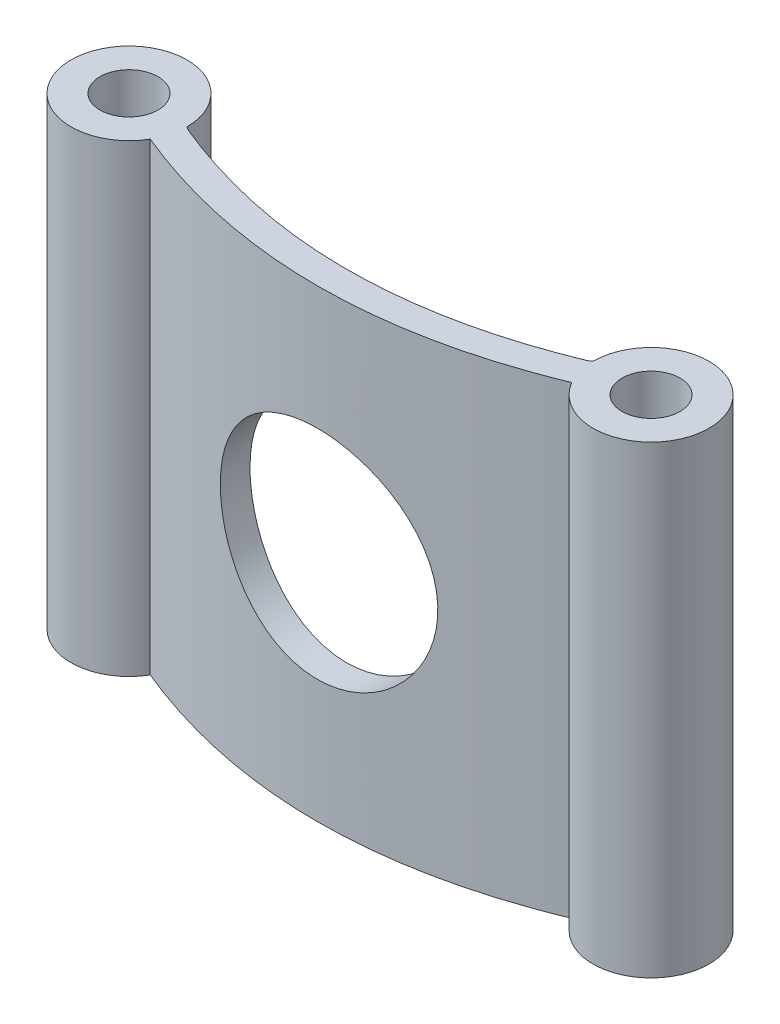
ISO-10303-21;
HEADER;
FILE_DESCRIPTION(('STEP AP214'),'2;1');
FILE_NAME('part.step','',(''),(''),'','','');
FILE_SCHEMA(('AUTOMOTIVE_DESIGN { 1 0 10303 214 1 1 1 1 }'));
ENDSEC;
DATA;
#1=APPLICATION_CONTEXT('core data for automotive mechanical design processes');
#2=APPLICATION_PROTOCOL_DEFINITION('international standard','automotive_design',2000,#1);
#3=PRODUCT_CONTEXT('',#1,'mechanical');
#4=PRODUCT('Part','Part','',(#3));
#5=PRODUCT_RELATED_PRODUCT_CATEGORY('part','',(#4));
#6=PRODUCT_DEFINITION_FORMATION('','',#4);
#7=PRODUCT_DEFINITION_CONTEXT('part definition',#1,'design');
#8=PRODUCT_DEFINITION('design','',#6,#7);
#9=PRODUCT_DEFINITION_SHAPE('','',#8);
#10=(LENGTH_UNIT() NAMED_UNIT(*) SI_UNIT(.MILLI.,.METRE.));
#11=(NAMED_UNIT(*) PLANE_ANGLE_UNIT() SI_UNIT($,.RADIAN.));
#12=(NAMED_UNIT(*) SI_UNIT($,.STERADIAN.) SOLID_ANGLE_UNIT());
#13=UNCERTAINTY_MEASURE_WITH_UNIT(LENGTH_MEASURE(1.E-05),#10,'distance_accuracy_value','');
#14=(GEOMETRIC_REPRESENTATION_CONTEXT(3) GLOBAL_UNCERTAINTY_ASSIGNED_CONTEXT((#13)) GLOBAL_UNIT_ASSIGNED_CONTEXT((#10,
#11,#12)) REPRESENTATION_CONTEXT('',''));
#15=CARTESIAN_POINT('',(0.,0.,0.));
#16=DIRECTION('',(0.,0.,1.));
#17=DIRECTION('',(1.,0.,0.));
#18=AXIS2_PLACEMENT_3D('',#15,#16,#17);
#19=CARTESIAN_POINT('',(-14.5358983848622,32.,2.));
#20=CARTESIAN_POINT('',(0.,32.,8.));
#21=CARTESIAN_POINT('',(14.5358983848622,32.,2.));
#22=B_SPLINE_CURVE_WITH_KNOTS('',2,(#19,#20,#21),.UNSPECIFIED.,.F.,.F.,(3,3),(0.,1.),.UNSPECIFIED.);
#23=DIRECTION('',(0.,-1.,0.));
#24=VECTOR('',#23,1.);
#25=SURFACE_OF_LINEAR_EXTRUSION('',#22,#24);
#26=CARTESIAN_POINT('',(-14.5358983848622,0.,2.));
#27=CARTESIAN_POINT('',(0.,0.,8.));
#28=CARTESIAN_POINT('',(14.5358983848622,0.,2.));
#29=B_SPLINE_CURVE_WITH_KNOTS('',2,(#26,#27,#28),.UNSPECIFIED.,.F.,.F.,(3,3),(0.,1.),.UNSPECIFIED.);
#30=CARTESIAN_POINT('',(-14.5358983848622,0.,2.));
#31=VERTEX_POINT('',#30);
#32=CARTESIAN_POINT('',(14.5358983848622,0.,2.));
#33=VERTEX_POINT('',#32);
#34=EDGE_CURVE('E130',#31,#33,#29,.T.);
#35=ORIENTED_EDGE('',*,*,#34,.T.);
#36=DIRECTION('',(0.,-1.,0.));
#37=VECTOR('',#36,1.);
#38=CARTESIAN_POINT('',(14.5358983848622,32.,2.));
#39=LINE('',#38,#37);
#40=CARTESIAN_POINT('',(14.5358983848622,32.,2.));
#41=VERTEX_POINT('',#40);
#42=EDGE_CURVE('E11',#41,#33,#39,.T.);
#43=ORIENTED_EDGE('',*,*,#42,.F.);
#44=CARTESIAN_POINT('',(-14.5358983848622,32.,2.));
#45=VERTEX_POINT('',#44);
#46=EDGE_CURVE('E151',#45,#41,#22,.T.);
#47=ORIENTED_EDGE('',*,*,#46,.F.);
#48=DIRECTION('',(0.,-1.,0.));
#49=VECTOR('',#48,1.);
#50=CARTESIAN_POINT('',(-14.5358983848622,32.,2.));
#51=LINE('',#50,#49);
#52=EDGE_CURVE('E123',#45,#31,#51,.T.);
#53=ORIENTED_EDGE('',*,*,#52,.T.);
#54=EDGE_LOOP('',(#35,#43,#47,#53));
#55=FACE_BOUND('',#54,.T.);
#56=CARTESIAN_POINT('',(-7.5,16.,4.20134351051979));
#57=CARTESIAN_POINT('',(-7.50000452314453,15.7917840121621,4.20134102074168));
#58=CARTESIAN_POINT('',(-7.49132714102422,15.5836230682951,4.20319340882975));
#59=CARTESIAN_POINT('',(-7.45669673623844,15.1687463145531,4.21054405183247));
#60=CARTESIAN_POINT('',(-7.43074097566046,14.9620307389561,4.2160428845581));
#61=CARTESIAN_POINT('',(-7.36173981347444,14.5515034712869,4.23053483341372));
#62=CARTESIAN_POINT('',(-7.31868621992593,14.3476932197777,4.23952962448864));
#63=CARTESIAN_POINT('',(-7.21581510514059,13.9444406505712,4.26075869470817));
#64=CARTESIAN_POINT('',(-7.15599140890996,13.7449999710334,4.27299416702664));
#65=CARTESIAN_POINT('',(-7.02014768652466,13.3522374987279,4.30033614490596));
#66=CARTESIAN_POINT('',(-6.9441507578945,13.158907426721,4.31543855281494));
#67=CARTESIAN_POINT('',(-6.7764493102566,12.7793161194467,4.34810837528087));
#68=CARTESIAN_POINT('',(-6.68473891572607,12.5930575602735,4.36567671144302));
#69=CARTESIAN_POINT('',(-6.48634257252211,12.2290170821616,4.40277803206502));
#70=CARTESIAN_POINT('',(-6.37966370094062,12.0512312102481,4.42231008684923));
#71=CARTESIAN_POINT('',(-6.15199414055335,11.7051317432981,4.46281906493769));
#72=CARTESIAN_POINT('',(-6.03099692898649,11.5368225173001,4.48379664492343));
#73=CARTESIAN_POINT('',(-5.77379785135889,11.2086203213897,4.52691163019913));
#74=CARTESIAN_POINT('',(-5.6374100901805,11.0488745745115,4.54906100263109));
#75=CARTESIAN_POINT('',(-5.35180683004208,10.7414676698138,4.59362286762069));
#76=CARTESIAN_POINT('',(-5.20259696844999,10.5938012563683,4.61603524084279));
#77=CARTESIAN_POINT('',(-4.89222290057548,10.3113976268094,4.6605212072488));
#78=CARTESIAN_POINT('',(-4.73105287981296,10.176666773349,4.682594629273));
#79=CARTESIAN_POINT('',(-4.39796213357204,9.92118699618139,4.72576834517189));
#80=CARTESIAN_POINT('',(-4.22604546545395,9.80043284413488,4.7468690011455));
#81=CARTESIAN_POINT('',(-3.87072293803859,9.57251896072931,4.78772613748365));
#82=CARTESIAN_POINT('',(-3.68721647640698,9.4655130809869,4.80746642160682));
#83=CARTESIAN_POINT('',(-3.31168646562439,9.26740895832705,4.84478333374874));
#84=CARTESIAN_POINT('',(-3.11966618629822,9.17630467346674,4.86236078280235));
#85=CARTESIAN_POINT('',(-2.7283705866556,9.01064114208361,4.89485095190807));
#86=CARTESIAN_POINT('',(-2.52909446058429,8.9360837396393,4.90976337491852));
#87=CARTESIAN_POINT('',(-2.12473971814208,8.80411866582994,4.9364816022592));
#88=CARTESIAN_POINT('',(-1.9196611972736,8.74671071237926,4.94828745768795));
#89=CARTESIAN_POINT('',(-1.50821447986118,8.65021845044771,4.96829501895445));
#90=CARTESIAN_POINT('',(-1.30190825619322,8.61088016299805,4.97654657251156));
#91=CARTESIAN_POINT('',(-0.886612847595548,8.54963280481994,4.98945107383297));
#92=CARTESIAN_POINT('',(-0.677623686127474,8.5277235817839,4.99410405304415));
#93=CARTESIAN_POINT('',(-0.258514518111144,8.50151674267163,4.99967455675355));
#94=CARTESIAN_POINT('',(-0.0483946224769565,8.49721742966441,5.00059244117393));
#95=CARTESIAN_POINT('',(0.371446735660269,8.50626172941433,4.99866667063135));
#96=CARTESIAN_POINT('',(0.581168201743314,8.51960518288795,4.99582304962824));
#97=CARTESIAN_POINT('',(0.995223274147202,8.56345807257184,4.98653552717203));
#98=CARTESIAN_POINT('',(1.19958868785332,8.59368068750273,4.9801517939912));
#99=CARTESIAN_POINT('',(1.60507612191739,8.67085680498452,4.96400511709771));
#100=CARTESIAN_POINT('',(1.80619693741542,8.7178163797181,4.95424094699662));
#101=CARTESIAN_POINT('',(2.20368644069986,8.82808955338244,4.93161034866328));
#102=CARTESIAN_POINT('',(2.40005591576668,8.89140042238278,4.91874443830594));
#103=CARTESIAN_POINT('',(2.78674469859136,9.03390244456974,4.89026732916708));
#104=CARTESIAN_POINT('',(2.97706380567011,9.11309412385704,4.87465603943853));
#105=CARTESIAN_POINT('',(3.3517018884572,9.28739386525736,4.8409990119725));
#106=CARTESIAN_POINT('',(3.53596858832703,9.38261107913964,4.8229367560499));
#107=CARTESIAN_POINT('',(3.89584822746171,9.5878801497422,4.78496265456379));
#108=CARTESIAN_POINT('',(4.07146094832069,9.69793238060152,4.7650507623564));
#109=CARTESIAN_POINT('',(4.4128680122206,9.93209744605256,4.72392382177242));
#110=CARTESIAN_POINT('',(4.57866296364888,10.0562094079998,4.70270885431111));
#111=CARTESIAN_POINT('',(4.89942190400867,10.3177032343873,4.65954375767458));
#112=CARTESIAN_POINT('',(5.05438231360881,10.4550894487792,4.63759338905942));
#113=CARTESIAN_POINT('',(5.35531703617126,10.744995010051,4.59312767527522));
#114=CARTESIAN_POINT('',(5.50105695083983,10.8977573716524,4.57060966445502));
#115=CARTESIAN_POINT('',(5.77917629530651,11.2150621448862,4.5260661002841));
#116=CARTESIAN_POINT('',(5.91155568307,11.3796045935781,4.50404054848292));
#117=CARTESIAN_POINT('',(6.16206070603077,11.7193961765362,4.46109790782628));
#118=CARTESIAN_POINT('',(6.28018333514588,11.8946475571212,4.44018105326273));
#119=CARTESIAN_POINT('',(6.50125766596422,12.2545712116014,4.40006157482876));
#120=CARTESIAN_POINT('',(6.60421486681417,12.4392400377679,4.38085833058549));
#121=CARTESIAN_POINT('',(6.79449957611369,12.8172852215516,4.34465949659002));
#122=CARTESIAN_POINT('',(6.88178537137355,13.0106831523778,4.32766983079951));
#123=CARTESIAN_POINT('',(7.03969293887026,13.4042974506197,4.29645759872901));
#124=CARTESIAN_POINT('',(7.11032116523742,13.6045111426829,4.28223396110168));
#125=CARTESIAN_POINT('',(7.23440132535534,14.0104077100544,4.25696252710365));
#126=CARTESIAN_POINT('',(7.28785186488795,14.216091027836,4.24591498852708));
#127=CARTESIAN_POINT('',(7.3771303408936,14.6314025242429,4.22732567978557));
#128=CARTESIAN_POINT('',(7.41295858738952,14.8410306334016,4.21978384794608));
#129=CARTESIAN_POINT('',(7.4661906039657,15.2587233025855,4.20853770093757));
#130=CARTESIAN_POINT('',(7.48392660991452,15.4667437127133,4.20476421428175));
#131=CARTESIAN_POINT('',(7.50199713441509,15.8835721108035,4.20091929158205));
#132=CARTESIAN_POINT('',(7.50233186928117,16.0923800889434,4.20084780951873));
#133=CARTESIAN_POINT('',(7.48559787774282,16.5092526049351,4.2044088401349));
#134=CARTESIAN_POINT('',(7.46853017483207,16.7173171857863,4.20804113498327));
#135=CARTESIAN_POINT('',(7.4171326572696,17.1312071037453,4.21890404435563));
#136=CARTESIAN_POINT('',(7.3828028840498,17.3370324462265,4.22613465024304));
#137=CARTESIAN_POINT('',(7.29761559028957,17.7427919499212,4.24389021391933));
#138=CARTESIAN_POINT('',(7.24693802158827,17.9427655102693,4.25437925924222));
#139=CARTESIAN_POINT('',(7.12932895939828,18.3377657298037,4.27838546031437));
#140=CARTESIAN_POINT('',(7.06239155605412,18.5327905617778,4.29190371693242));
#141=CARTESIAN_POINT('',(6.91279831489933,18.9164358121414,4.32158650558548));
#142=CARTESIAN_POINT('',(6.83014727465627,19.1050581646254,4.33775022971753));
#143=CARTESIAN_POINT('',(6.64968039820019,19.4747781492301,4.37228995091549));
#144=CARTESIAN_POINT('',(6.55185880783536,19.6558728929611,4.39066678681571));
#145=CARTESIAN_POINT('',(6.34034717520623,20.0116581645379,4.42938765686985));
#146=CARTESIAN_POINT('',(6.22646149689398,20.1862298790443,4.44975481446887));
#147=CARTESIAN_POINT('',(5.98458516362054,20.5252762745822,4.49169053629626));
#148=CARTESIAN_POINT('',(5.85658814154071,20.6897463451495,4.51325964066126));
#149=CARTESIAN_POINT('',(5.58738697426111,21.0074405432904,4.55700079588158));
#150=CARTESIAN_POINT('',(5.44618145251657,21.1606634957513,4.57917290940928));
#151=CARTESIAN_POINT('',(5.15158120865707,21.4547699190946,4.62350117408771));
#152=CARTESIAN_POINT('',(4.99819185714754,21.5956587698805,4.64565732797506));
#153=CARTESIAN_POINT('',(4.6773870849487,21.8665916807916,4.68974106231974));
#154=CARTESIAN_POINT('',(4.50977287563485,21.9964022482656,4.71165782166057));
#155=CARTESIAN_POINT('',(4.16411640963145,22.2413934957823,4.75422659235289));
#156=CARTESIAN_POINT('',(3.98607806605351,22.3565796148915,4.77487907242149));
#157=CARTESIAN_POINT('',(3.62066845720732,22.5715837247262,4.81434461527897));
#158=CARTESIAN_POINT('',(3.43329388402788,22.6713962164493,4.83315701901572));
#159=CARTESIAN_POINT('',(3.05064746412634,22.8548192410069,4.86838330876895));
#160=CARTESIAN_POINT('',(2.85537875990049,22.9384361456931,4.88479813743904));
#161=CARTESIAN_POINT('',(2.45937905735277,23.0884434354868,4.91467413093448));
#162=CARTESIAN_POINT('',(2.25868510944075,23.1549283855769,4.92815144370566));
#163=CARTESIAN_POINT('',(1.85222162207928,23.2707586290768,4.95187576878025));
#164=CARTESIAN_POINT('',(1.64645209282668,23.3201039569173,4.96212278757275));
#165=CARTESIAN_POINT('',(1.23136217843442,23.4012473744243,4.97908320996206));
#166=CARTESIAN_POINT('',(1.02204221438644,23.433047530205,4.98579702962299));
#167=CARTESIAN_POINT('',(0.601378800394487,23.4788438390621,4.99549314089661));
#168=CARTESIAN_POINT('',(0.390035381782616,23.4928402673719,4.99847549019522));
#169=CARTESIAN_POINT('',(-0.0289166766926556,23.5028127913488,5.00059885313099));
#170=CARTESIAN_POINT('',(-0.236516683091523,23.4991391707777,4.99981453609454));
#171=CARTESIAN_POINT('',(-0.650649886051365,23.4746023616058,4.99459796001535));
#172=CARTESIAN_POINT('',(-0.857183097510513,23.4537394137168,4.99016575205608));
#173=CARTESIAN_POINT('',(-1.26770198059697,23.3949933067822,4.97778053111995));
#174=CARTESIAN_POINT('',(-1.47168769870243,23.3571104587265,4.9698275824746));
#175=CARTESIAN_POINT('',(-1.87567402522262,23.2646257408227,4.95062743440625));
#176=CARTESIAN_POINT('',(-2.07567461685061,23.2100238005639,4.9393802211098));
#177=CARTESIAN_POINT('',(-2.46968959102409,23.084718751118,4.9139485702058));
#178=CARTESIAN_POINT('',(-2.66372053560656,23.0140658268907,4.8997732997328));
#179=CARTESIAN_POINT('',(-3.04519396917166,22.8570658927389,4.86885268646529));
#180=CARTESIAN_POINT('',(-3.23263403433204,22.7707131797235,4.85210641007454));
#181=CARTESIAN_POINT('',(-3.59958313092116,22.5829682829802,4.81651013098762));
#182=CARTESIAN_POINT('',(-3.77909316460649,22.4815780069104,4.79766039521031));
#183=CARTESIAN_POINT('',(-4.12904267589869,22.2644561813497,4.75836743864169));
#184=CARTESIAN_POINT('',(-4.29948178980606,22.1487240574391,4.73792415403775));
#185=CARTESIAN_POINT('',(-4.63320329256558,21.9014689400215,4.6956129101));
#186=CARTESIAN_POINT('',(-4.79629841171236,21.7696964020555,4.67372576479308));
#187=CARTESIAN_POINT('',(-5.11085430515938,21.4929997691378,4.62947892715598));
#188=CARTESIAN_POINT('',(-5.26231494809418,21.3480755257299,4.60711922949383));
#189=CARTESIAN_POINT('',(-5.55262472625379,21.0460131713346,4.5625412575193));
#190=CARTESIAN_POINT('',(-5.69147079979998,20.8888721122899,4.54032301875074));
#191=CARTESIAN_POINT('',(-5.95556548551079,20.5634580643727,4.49665021201883));
#192=CARTESIAN_POINT('',(-6.08081439883635,20.3951853221866,4.47519562714854));
#193=CARTESIAN_POINT('',(-6.31829762137213,20.0464986117423,4.43339252639135));
#194=CARTESIAN_POINT('',(-6.43035366927441,19.8659611463264,4.41306078315659));
#195=CARTESIAN_POINT('',(-6.63878735093998,19.4959375895637,4.37438381490339));
#196=CARTESIAN_POINT('',(-6.73517074240835,19.3064548176376,4.35603786119212));
#197=CARTESIAN_POINT('',(-6.91153014804442,18.919904859959,4.32186657512832));
#198=CARTESIAN_POINT('',(-6.99151561481355,18.7228421219414,4.3060397917806));
#199=CARTESIAN_POINT('',(-7.13450443872548,18.3225079589355,4.27736052843212));
#200=CARTESIAN_POINT('',(-7.19751094173113,18.1192376918593,4.26450749751695));
#201=CARTESIAN_POINT('',(-7.33396705179776,17.6020577177105,4.23641087679208));
#202=CARTESIAN_POINT('',(-7.3961400067678,17.2849795284931,4.22333392868557));
#203=CARTESIAN_POINT('',(-7.47915214943174,16.645223380197,4.20580234673054));
#204=CARTESIAN_POINT('',(-7.49999299323463,16.3225456460052,4.20134736741424));
#205=CARTESIAN_POINT('',(-7.5,16.,4.20134351051979));
#206=B_SPLINE_CURVE_WITH_KNOTS('',3,(#56,#57,#58,#59,#60,#61,#62,#63,#64,#65,#66,#67,#68,#69,
#70,#71,#72,#73,#74,#75,#76,#77,#78,#79,#80,#81,#82,#83,#84,#85,#86,#87,#88,#89,#90,#91,#92,#93,
#94,#95,#96,#97,#98,#99,#100,#101,#102,#103,#104,#105,#106,#107,#108,#109,#110,#111,#112,#113,
#114,#115,#116,#117,#118,#119,#120,#121,#122,#123,#124,#125,#126,#127,#128,#129,#130,#131,#132,
#133,#134,#135,#136,#137,#138,#139,#140,#141,#142,#143,#144,#145,#146,#147,#148,#149,#150,#151,
#152,#153,#154,#155,#156,#157,#158,#159,#160,#161,#162,#163,#164,#165,#166,#167,#168,#169,#170,
#171,#172,#173,#174,#175,#176,#177,#178,#179,#180,#181,#182,#183,#184,#185,#186,#187,#188,#189,
#190,#191,#192,#193,#194,#195,#196,#197,#198,#199,#200,#201,#202,#203,#204,#205),.UNSPECIFIED.,
.T.,.F.,(4,2,2,2,2,2,2,2,2,2,2,2,2,2,2,2,2,2,2,2,2,2,2,2,2,2,2,2,2,2,2,2,2,2,2,2,2,2,2,2,2,2,2,
2,2,2,2,2,2,2,2,2,2,2,2,2,2,2,2,2,2,2,2,2,2,2,2,2,2,2,2,2,2,2,4),(0.,0.624364367969593,
1.24882769557594,1.87359057869415,2.49858381137771,3.1226903897051,3.74703084304495,
4.37107709686634,4.9954087391606,5.62830955181029,6.26093351302067,6.89386706761548,
7.52656308690282,8.16581591713947,8.80482532670235,9.44390591537996,10.0829759914526,
10.712765888114,11.3425502811617,11.9722739853246,12.6019920042154,13.2213214709593,
13.8408758600439,14.4603268782126,15.079798420993,15.7036739705628,16.327565257215,
16.9514178420389,17.5754755602505,18.2117126047759,18.8479516509544,19.4843246166258,
20.1204662555595,20.7582768145527,21.395839840417,22.0334546006965,22.6710581432394,
23.2967300298006,23.9223941386639,24.5480214523186,25.173647264368,25.7926087999478,
26.4117956429246,27.0307937432119,27.6500272047655,28.2775847506471,28.9054266219848,
29.5333339979143,30.1609661134748,30.7996041269413,31.4380039205659,32.0766315361604,
32.7150073829826,33.3497801541773,33.9845516502144,34.6192483797932,35.2539352972821,
35.8760929009451,36.4982417923334,37.1203793161924,37.7425194601544,38.3627405593325,
38.9831874112572,39.6035556208038,40.2239486853693,40.8556589419822,41.4873763302185,
42.1192466350799,42.7511029419083,43.3907009516038,44.0300634570242,44.669056358441,
45.3079307857089,46.2751671645751,47.2423647871043),.UNSPECIFIED.);
#207=CARTESIAN_POINT('',(-7.5,16.,4.20134351051979));
#208=VERTEX_POINT('',#207);
#209=EDGE_CURVE('E209',#208,#208,#206,.T.);
#210=ORIENTED_EDGE('',*,*,#209,.F.);
#211=EDGE_LOOP('',(#210));
#212=FACE_BOUND('',#211,.T.);
#213=ADVANCED_FACE('F34',(#55,#212),#25,.F.);
#214=CARTESIAN_POINT('',(13.7728081212217,32.,0.151299578207173));
#215=CARTESIAN_POINT('',(13.2001572419338,32.,0.387673360188581));
#216=CARTESIAN_POINT('',(12.0361648898371,32.,0.838289070153815));
#217=CARTESIAN_POINT('',(9.73499066158583,32.,1.60965166706434));
#218=CARTESIAN_POINT('',(6.86117720900503,32.,2.35105477044337));
#219=CARTESIAN_POINT('',(3.42772446671129,32.,2.88209484382654));
#220=CARTESIAN_POINT('',(0.,32.,3.05895257808673));
#221=CARTESIAN_POINT('',(-3.42772446671129,32.,2.88209484382654));
#222=CARTESIAN_POINT('',(-6.86117720900502,32.,2.35105477044337));
#223=CARTESIAN_POINT('',(-9.73499066158583,32.,1.60965166706434));
#224=CARTESIAN_POINT('',(-12.036164889837,32.,0.838289070153814));
#225=CARTESIAN_POINT('',(-13.2001572419338,32.,0.387673360188581));
#226=CARTESIAN_POINT('',(-13.7728081212217,32.,0.151299578207173));
#227=B_SPLINE_CURVE_WITH_KNOTS('',3,(#214,#215,#216,#217,#218,#219,#220,#221,#222,#223,#224,
#225,#226),.UNSPECIFIED.,.F.,.F.,(4,1,1,1,1,1,1,1,1,1,4),(0.,0.0625,0.125,0.25,0.375,0.5,0.625,
0.75,0.875,0.9375,1.),.UNSPECIFIED.);
#228=DIRECTION('',(0.,-1.,0.));
#229=VECTOR('',#228,1.);
#230=SURFACE_OF_LINEAR_EXTRUSION('',#227,#229);
#231=CARTESIAN_POINT('',(13.7728081212217,0.,0.151299578207173));
#232=CARTESIAN_POINT('',(13.2001572419338,0.,0.387673360188581));
#233=CARTESIAN_POINT('',(12.0361648898371,0.,0.838289070153815));
#234=CARTESIAN_POINT('',(9.73499066158583,0.,1.60965166706434));
#235=CARTESIAN_POINT('',(6.86117720900503,0.,2.35105477044337));
#236=CARTESIAN_POINT('',(3.42772446671129,0.,2.88209484382654));
#237=CARTESIAN_POINT('',(0.,0.,3.05895257808673));
#238=CARTESIAN_POINT('',(-3.42772446671129,0.,2.88209484382654));
#239=CARTESIAN_POINT('',(-6.86117720900502,0.,2.35105477044337));
#240=CARTESIAN_POINT('',(-9.73499066158583,0.,1.60965166706434));
#241=CARTESIAN_POINT('',(-12.036164889837,0.,0.838289070153814));
#242=CARTESIAN_POINT('',(-13.2001572419338,0.,0.387673360188581));
#243=CARTESIAN_POINT('',(-13.7728081212217,0.,0.151299578207173));
#244=B_SPLINE_CURVE_WITH_KNOTS('',3,(#231,#232,#233,#234,#235,#236,#237,#238,#239,#240,#241,
#242,#243),.UNSPECIFIED.,.F.,.F.,(4,1,1,1,1,1,1,1,1,1,4),(0.,0.0625,0.125,0.25,0.375,0.5,0.625,
0.75,0.875,0.9375,1.),.UNSPECIFIED.);
#245=CARTESIAN_POINT('',(13.7728081212217,0.,0.151299578207173));
#246=VERTEX_POINT('',#245);
#247=CARTESIAN_POINT('',(-13.7728081212217,0.,0.151299578207173));
#248=VERTEX_POINT('',#247);
#249=EDGE_CURVE('E117',#246,#248,#244,.T.);
#250=ORIENTED_EDGE('',*,*,#249,.T.);
#251=DIRECTION('',(0.,-1.,0.));
#252=VECTOR('',#251,1.);
#253=CARTESIAN_POINT('',(-13.7728081212217,32.,0.151299578207173));
#254=LINE('',#253,#252);
#255=CARTESIAN_POINT('',(-13.7728081212217,32.,0.151299578207173));
#256=VERTEX_POINT('',#255);
#257=EDGE_CURVE('E113',#256,#248,#254,.T.);
#258=ORIENTED_EDGE('',*,*,#257,.F.);
#259=CARTESIAN_POINT('',(13.7728081212217,32.,0.151299578207173));
#260=VERTEX_POINT('',#259);
#261=EDGE_CURVE('E101',#260,#256,#227,.T.);
#262=ORIENTED_EDGE('',*,*,#261,.F.);
#263=DIRECTION('',(0.,-1.,0.));
#264=VECTOR('',#263,1.);
#265=CARTESIAN_POINT('',(13.7728081212217,32.,0.151299578207173));
#266=LINE('',#265,#264);
#267=EDGE_CURVE('E118',#260,#246,#266,.T.);
#268=ORIENTED_EDGE('',*,*,#267,.T.);
#269=EDGE_LOOP('',(#250,#258,#262,#268));
#270=FACE_BOUND('',#269,.T.);
#271=CARTESIAN_POINT('',(-7.50000000000002,16.,2.15384902722729));
#272=CARTESIAN_POINT('',(-7.50000498496616,16.2079203584473,2.15384615253984));
#273=CARTESIAN_POINT('',(-7.49135196460779,16.4157819946656,2.15580225611849));
#274=CARTESIAN_POINT('',(-7.45682125415142,16.8300580487845,2.16356384196695));
#275=CARTESIAN_POINT('',(-7.43094105441831,17.0364722513966,2.16936988509093));
#276=CARTESIAN_POINT('',(-7.36214587214732,17.4463848128392,2.18467124380285));
#277=CARTESIAN_POINT('',(-7.31922354798436,17.6498818757897,2.1941681493505));
#278=CARTESIAN_POINT('',(-7.21667330887841,18.0525095905825,2.21658242306366));
#279=CARTESIAN_POINT('',(-7.15703923524259,18.2516386034637,2.22950105212243));
#280=CARTESIAN_POINT('',(-7.02164027556791,18.6437722493372,2.25836938090625));
#281=CARTESIAN_POINT('',(-6.94589945002921,18.8367855293378,2.27431455575778));
#282=CARTESIAN_POINT('',(-6.77877542150199,19.2157593632823,2.30880870233135));
#283=CARTESIAN_POINT('',(-6.68738636527363,19.4017172462353,2.32735864790222));
#284=CARTESIAN_POINT('',(-6.48969503502304,19.7651876490394,2.36653603986869));
#285=CARTESIAN_POINT('',(-6.38339949645923,19.9427039349617,2.38716254679405));
#286=CARTESIAN_POINT('',(-6.15655711503239,20.2883037914313,2.4299460544176));
#287=CARTESIAN_POINT('',(-6.03600377099118,20.4563830070139,2.45210375136839));
#288=CARTESIAN_POINT('',(-5.7795509789066,20.7844327540296,2.49768717240942));
#289=CARTESIAN_POINT('',(-5.64344489071792,20.9442398029317,2.5211271137133));
#290=CARTESIAN_POINT('',(-5.35841012449202,21.2517979682743,2.56829531996932));
#291=CARTESIAN_POINT('',(-5.20948705713927,21.399554305347,2.59202345489579));
#292=CARTESIAN_POINT('',(-4.89968232476717,21.6821736473694,2.63913253992869));
#293=CARTESIAN_POINT('',(-4.73879477210907,21.8170302288119,2.66251331221956));
#294=CARTESIAN_POINT('',(-4.40625497005439,22.072800098801,2.70825751693096));
#295=CARTESIAN_POINT('',(-4.23460678266235,22.1937186004478,2.73062132780652));
#296=CARTESIAN_POINT('',(-3.87957094554592,22.4221494131681,2.77396835499988));
#297=CARTESIAN_POINT('',(-3.69606978148827,22.5294890340767,2.79493244078559));
#298=CARTESIAN_POINT('',(-3.32049548527567,22.7282563196486,2.83458000070808));
#299=CARTESIAN_POINT('',(-3.12842565554257,22.8196900491103,2.85326434327899));
#300=CARTESIAN_POINT('',(-2.73697531726999,22.985999771699,2.88781656254836));
#301=CARTESIAN_POINT('',(-2.53759406287629,23.060874070054,2.90368415093385));
#302=CARTESIAN_POINT('',(-2.13297366332177,23.1934514880032,2.93212857711777));
#303=CARTESIAN_POINT('',(-1.92773462719894,23.2511549269913,2.94470547612553));
#304=CARTESIAN_POINT('',(-1.51626116828664,23.3481226168066,2.96601702952895));
#305=CARTESIAN_POINT('',(-1.31009646286427,23.3876698511801,2.97481050579775));
#306=CARTESIAN_POINT('',(-0.895052396520995,23.449355406869,2.98858836343948));
#307=CARTESIAN_POINT('',(-0.686173061912021,23.4714938967933,2.9935727817043));
#308=CARTESIAN_POINT('',(-0.267259406319987,23.49817432027,2.99958520331428));
#309=CARTESIAN_POINT('',(-0.0572252128739521,23.5027181593002,3.00061363508756));
#310=CARTESIAN_POINT('',(0.362464750687154,23.4941758132722,2.99868511655903));
#311=CARTESIAN_POINT('',(0.572120524661702,23.4810898090489,2.9957282071361));
#312=CARTESIAN_POINT('',(0.985668416123831,23.4378011814098,2.98600645010231));
#313=CARTESIAN_POINT('',(1.18959566939451,23.4079173408756,2.97931253759514));
#314=CARTESIAN_POINT('',(1.5941542130563,23.3315106192581,2.96235902146937));
#315=CARTESIAN_POINT('',(1.79478555022657,23.2849879745442,2.95209946850402));
#316=CARTESIAN_POINT('',(2.19133398995177,23.1756776744499,2.92830575982567));
#317=CARTESIAN_POINT('',(2.38725177657764,23.1128923949952,2.9147720824722));
#318=CARTESIAN_POINT('',(2.7731465022756,22.9715064068836,2.88480127387128));
#319=CARTESIAN_POINT('',(2.96312118382915,22.8928997707017,2.8683630547101));
#320=CARTESIAN_POINT('',(3.33719514364526,22.719815482446,2.83290734708456));
#321=CARTESIAN_POINT('',(3.52123948275077,22.6252229037373,2.81387138863673));
#322=CARTESIAN_POINT('',(3.88079328146255,22.4212291413328,2.77383246935284));
#323=CARTESIAN_POINT('',(4.05629953642543,22.3118224547892,2.7528287784805));
#324=CARTESIAN_POINT('',(4.3975170495211,22.0790203387657,2.70943682650623));
#325=CARTESIAN_POINT('',(4.56323111317925,21.9556289458479,2.68704896577637));
#326=CARTESIAN_POINT('',(4.88392792257445,21.6956021549097,2.64147701658106));
#327=CARTESIAN_POINT('',(5.03890571437871,21.5589607119164,2.61829256783809));
#328=CARTESIAN_POINT('',(5.34034410502551,21.2702217993073,2.57124659604314));
#329=CARTESIAN_POINT('',(5.48654131886294,21.1178498182943,2.5473814210252));
#330=CARTESIAN_POINT('',(5.76554508742586,20.8013513346891,2.5001610233571));
#331=CARTESIAN_POINT('',(5.89835749524368,20.6372300241786,2.47680558133509));
#332=CARTESIAN_POINT('',(6.14980343604187,20.298194877971,2.43124054782396));
#333=CARTESIAN_POINT('',(6.26843054768267,20.123276208486,2.40903147783562));
#334=CARTESIAN_POINT('',(6.49054534352546,19.7639624854259,2.36640873470065));
#335=CARTESIAN_POINT('',(6.59403891404393,19.5795711542349,2.34599436472925));
#336=CARTESIAN_POINT('',(6.78547506069164,19.2019188168567,2.30747532240992));
#337=CARTESIAN_POINT('',(6.87336802413785,19.00863189118,2.28937806800048));
#338=CARTESIAN_POINT('',(7.03249285095978,18.6151598306126,2.25610221422046));
#339=CARTESIAN_POINT('',(7.10373120873092,18.4149774196431,2.24092247758789));
#340=CARTESIAN_POINT('',(7.2290227233187,18.0090665136188,2.21391942095967));
#341=CARTESIAN_POINT('',(7.28307470620796,17.8033376407497,2.20209633024798));
#342=CARTESIAN_POINT('',(7.37353647409453,17.3878609913518,2.18216065001089));
#343=CARTESIAN_POINT('',(7.40994660901766,17.1781132946221,2.1740479868894));
#344=CARTESIAN_POINT('',(7.46424292492471,16.7605732042476,2.16190473726341));
#345=CARTESIAN_POINT('',(7.48249972255063,16.5528313126736,2.15779251767419));
#346=CARTESIAN_POINT('',(7.5016522196633,16.1365093670268,2.15347776669189));
#347=CARTESIAN_POINT('',(7.50254815980509,15.9279293246126,2.15327518110373));
#348=CARTESIAN_POINT('',(7.48697228111165,15.5114665802997,2.15678543872665));
#349=CARTESIAN_POINT('',(7.47050161039745,15.3035838332136,2.1604980231026));
#350=CARTESIAN_POINT('',(7.42033140410978,14.8900130738795,2.17173049586404));
#351=CARTESIAN_POINT('',(7.38663191785451,14.6843250553506,2.179250373351));
#352=CARTESIAN_POINT('',(7.30279097476735,14.2790878209059,2.1977675556886));
#353=CARTESIAN_POINT('',(7.25285306127813,14.0794944631132,2.20872175444872));
#354=CARTESIAN_POINT('',(7.13680147934778,13.6851965508443,2.23383248963943));
#355=CARTESIAN_POINT('',(7.07068194003616,13.4904937990668,2.24799018819377));
#356=CARTESIAN_POINT('',(6.92279924511584,13.1074247202441,2.2791094592431));
#357=CARTESIAN_POINT('',(6.84104077674208,12.9190565144748,2.29607019141783));
#358=CARTESIAN_POINT('',(6.6624305788048,12.54976737727,2.33234189201858));
#359=CARTESIAN_POINT('',(6.56557311325712,12.3688493092362,2.35165375300579));
#360=CARTESIAN_POINT('',(6.35591908566581,12.0130768771244,2.39240197482172));
#361=CARTESIAN_POINT('',(6.2429069268889,11.8383526836575,2.4138656566882));
#362=CARTESIAN_POINT('',(6.00279598860437,11.4989248738595,2.45808993286323));
#363=CARTESIAN_POINT('',(5.87569085255209,11.3342258316104,2.48085111013124));
#364=CARTESIAN_POINT('',(5.60827973599411,11.0159855944395,2.52704159720326));
#365=CARTESIAN_POINT('',(5.46797221062186,10.862445709032,2.55047098497326));
#366=CARTESIAN_POINT('',(5.17516195412922,10.56761128457,2.59734648094834));
#367=CARTESIAN_POINT('',(5.02266456949648,10.426311433071,2.62079257740132));
#368=CARTESIAN_POINT('',(4.70328779873573,10.1541497280846,2.66753125389519));
#369=CARTESIAN_POINT('',(4.53618384783537,10.0235491480259,2.69081165605905));
#370=CARTESIAN_POINT('',(4.19146503543617,9.77693672327235,2.73606755685081));
#371=CARTESIAN_POINT('',(4.01385411184346,9.66091946320564,2.75804353825298));
#372=CARTESIAN_POINT('',(3.64920698367584,9.44421742580039,2.800080718928));
#373=CARTESIAN_POINT('',(3.46216742796465,9.343538151778,2.82014122996521));
#374=CARTESIAN_POINT('',(3.08009132520866,9.15835641025262,2.85775206729305));
#375=CARTESIAN_POINT('',(2.88505798133296,9.07384753862996,2.87530338662371));
#376=CARTESIAN_POINT('',(2.4894862214873,8.92207176242887,2.90729306545155));
#377=CARTESIAN_POINT('',(2.28898755197543,8.85470508034202,2.92174935782825));
#378=CARTESIAN_POINT('',(1.88281369144963,8.73710022409097,2.94725520945348));
#379=CARTESIAN_POINT('',(1.67713851112423,8.68686201456271,2.95830477573566));
#380=CARTESIAN_POINT('',(1.26214289093463,8.60393593908606,2.976666979619));
#381=CARTESIAN_POINT('',(1.05282294427494,8.57124571733356,2.98398011882633));
#382=CARTESIAN_POINT('',(0.632069442750239,8.52368341251569,2.99465212429715));
#383=CARTESIAN_POINT('',(0.420635925057013,8.5088110166388,2.99801105998102));
#384=CARTESIAN_POINT('',(0.00193805956885966,8.4971417263742,3.00064510493916));
#385=CARTESIAN_POINT('',(-0.205314875842752,8.49995167107453,3.00000904226804));
#386=CARTESIAN_POINT('',(-0.618827409879543,8.52270579118125,2.99487877791333));
#387=CARTESIAN_POINT('',(-0.825087024088063,8.54264969690168,2.99038463695531));
#388=CARTESIAN_POINT('',(-1.23513111121121,8.59950721485159,2.97766732201739));
#389=CARTESIAN_POINT('',(-1.43891563599723,8.63642047081584,2.96944422632558));
#390=CARTESIAN_POINT('',(-1.84257312206714,8.72691899712618,2.94950444876563));
#391=CARTESIAN_POINT('',(-2.04244606590239,8.78050434182448,2.93778775131716));
#392=CARTESIAN_POINT('',(-2.43613740077973,8.90369003136637,2.9112441583963));
#393=CARTESIAN_POINT('',(-2.62997598997122,8.9732284663592,2.8964293052335));
#394=CARTESIAN_POINT('',(-3.01115570246733,9.12793585453605,2.86406923325334));
#395=CARTESIAN_POINT('',(-3.19849443861322,9.21311047956229,2.8465230240213));
#396=CARTESIAN_POINT('',(-3.56534388565829,9.3984433401092,2.80918906311055));
#397=CARTESIAN_POINT('',(-3.74485551201786,9.49859981724533,2.78940157455156));
#398=CARTESIAN_POINT('',(-4.09492083972704,9.71320614470429,2.74811608930075));
#399=CARTESIAN_POINT('',(-4.26547416220222,9.82765659887337,2.72661802035973));
#400=CARTESIAN_POINT('',(-4.59989471711754,10.0725396027595,2.68203809713824));
#401=CARTESIAN_POINT('',(-4.76355575888915,10.2032495747636,2.65893294177192));
#402=CARTESIAN_POINT('',(-5.07933578931312,10.477850921735,2.61218013384569));
#403=CARTESIAN_POINT('',(-5.231454633489,10.6217424616494,2.58853247449995));
#404=CARTESIAN_POINT('',(-5.52317813000344,10.9217823136566,2.54134173359715));
#405=CARTESIAN_POINT('',(-5.66277972802777,11.0779335998917,2.51779867888929));
#406=CARTESIAN_POINT('',(-5.92848478753774,11.4014263517617,2.47147434383305));
#407=CARTESIAN_POINT('',(-6.05458854302296,11.5687675735369,2.4486930469001));
#408=CARTESIAN_POINT('',(-6.29409979267002,11.9159576272408,2.40421475371738));
#409=CARTESIAN_POINT('',(-6.40730472221822,12.0959488153252,2.38253741349036));
#410=CARTESIAN_POINT('',(-6.61807638179176,12.4650023813085,2.34124779867172));
#411=CARTESIAN_POINT('',(-6.71564885360822,12.6540613952946,2.32163476677329));
#412=CARTESIAN_POINT('',(-6.89441763753761,13.0399025967964,2.2850449256645));
#413=CARTESIAN_POINT('',(-6.9756227366947,13.2366805721298,2.26806670305375));
#414=CARTESIAN_POINT('',(-7.12106267015843,13.6365796713218,2.23723542287405));
#415=CARTESIAN_POINT('',(-7.18530048427356,13.8396996743725,2.22338181661993));
#416=CARTESIAN_POINT('',(-7.32658532461739,14.3631193072264,2.19262018943442));
#417=CARTESIAN_POINT('',(-7.39151686968669,14.6869204772692,2.17816580465659));
#418=CARTESIAN_POINT('',(-7.47821918611074,15.3405305036954,2.15878273850242));
#419=CARTESIAN_POINT('',(-7.49999209625923,15.6703390615558,2.15385358508863));
#420=CARTESIAN_POINT('',(-7.50000000000002,16.,2.15384902722729));
#421=B_SPLINE_CURVE_WITH_KNOTS('',3,(#271,#272,#273,#274,#275,#276,#277,#278,#279,#280,#281,
#282,#283,#284,#285,#286,#287,#288,#289,#290,#291,#292,#293,#294,#295,#296,#297,#298,#299,#300,
#301,#302,#303,#304,#305,#306,#307,#308,#309,#310,#311,#312,#313,#314,#315,#316,#317,#318,#319,
#320,#321,#322,#323,#324,#325,#326,#327,#328,#329,#330,#331,#332,#333,#334,#335,#336,#337,#338,
#339,#340,#341,#342,#343,#344,#345,#346,#347,#348,#349,#350,#351,#352,#353,#354,#355,#356,#357,
#358,#359,#360,#361,#362,#363,#364,#365,#366,#367,#368,#369,#370,#371,#372,#373,#374,#375,#376,
#377,#378,#379,#380,#381,#382,#383,#384,#385,#386,#387,#388,#389,#390,#391,#392,#393,#394,#395,
#396,#397,#398,#399,#400,#401,#402,#403,#404,#405,#406,#407,#408,#409,#410,#411,#412,#413,#414,
#415,#416,#417,#418,#419,#420),.UNSPECIFIED.,.T.,.F.,(4,2,2,2,2,2,2,2,2,2,2,2,2,2,2,2,2,2,2,2,2,
2,2,2,2,2,2,2,2,2,2,2,2,2,2,2,2,2,2,2,2,2,2,2,2,2,2,2,2,2,2,2,2,2,2,2,2,2,2,2,2,2,2,2,2,2,2,2,2,
2,2,2,2,2,4),(0.,0.62347094967514,1.24703274574447,1.8708634597336,2.49492437377311,
3.1180595241009,3.74142827012051,4.36451625061058,4.98788944593778,5.62080373188166,
6.25344235271209,6.8863943772703,7.51910889256471,8.15919830241287,8.79904311340924,
9.43895337893295,10.0788517407892,10.7084064392444,11.3379550401944,11.9674354599413,
12.5969094229619,13.21482228782,13.8327263750085,14.4505402389967,15.0685860013501,
15.6912803864626,16.3142067154293,16.9369536979397,17.5599861405189,18.1967657939401,
18.8332657681776,19.4700527884504,20.1065914625064,20.7451195221514,21.383398173529,
22.0217204136168,22.6600299920735,23.2850225388184,23.9100064219525,24.5349489894752,
25.159889768084,25.7772810196827,26.3948966005036,27.0123273613691,27.6299932532594,
28.2568437986925,28.883978240031,29.5111861564556,30.1381204724375,30.7774370227306,
31.4165154633626,32.055822669952,32.6948761591371,33.3301202095089,33.965362948325,
34.6005203849415,35.2356666705075,35.8567413556456,36.4778062653409,37.0988581366032,
37.7199127775991,38.3385968574124,38.9575058025657,39.5763421647525,40.1952046784083,
40.8266382715815,41.4580797672584,42.0896749230848,42.7212563191924,43.3616837708734,
44.0018754520228,44.6417225167835,45.2814571362513,46.2700289443091,47.2585517609178),.UNSPECIFIED.);
#422=CARTESIAN_POINT('',(-7.50000000000002,16.,2.15384902722729));
#423=VERTEX_POINT('',#422);
#424=EDGE_CURVE('E39',#423,#423,#421,.T.);
#425=ORIENTED_EDGE('',*,*,#424,.F.);
#426=EDGE_LOOP('',(#425));
#427=FACE_BOUND('',#426,.T.);
#428=ADVANCED_FACE('F114',(#270,#427),#230,.F.);
#429=CARTESIAN_POINT('',(0.,32.,5.));
#430=DIRECTION('',(0.,-1.,0.));
#431=DIRECTION('',(0.,0.,-1.));
#432=AXIS2_PLACEMENT_3D('',#429,#430,#431);
#433=PLANE('',#432);
#434=ORIENTED_EDGE('',*,*,#46,.T.);
#435=CARTESIAN_POINT('',(18.,32.,0.));
#436=DIRECTION('',(0.,1.,0.));
#437=DIRECTION('',(0.,0.,1.));
#438=AXIS2_PLACEMENT_3D('',#435,#436,#437);
#439=CIRCLE('',#438,4.);
#440=CARTESIAN_POINT('',(14.,32.,0.));
#441=VERTEX_POINT('',#440);
#442=EDGE_CURVE('E94',#41,#441,#439,.T.);
#443=ORIENTED_EDGE('',*,*,#442,.T.);
#444=DIRECTION('',(-0.832323561692514,0.,0.554290076270077));
#445=VECTOR('',#444,1.);
#446=CARTESIAN_POINT('',(13.7728081212217,32.,0.151299578207173));
#447=LINE('',#446,#445);
#448=EDGE_CURVE('E108',#441,#260,#447,.T.);
#449=ORIENTED_EDGE('',*,*,#448,.T.);
#450=ORIENTED_EDGE('',*,*,#261,.T.);
#451=DIRECTION('',(-0.832323561692527,0.,-0.554290076270057));
#452=VECTOR('',#451,1.);
#453=CARTESIAN_POINT('',(-13.7728081212217,32.,0.151299578207173));
#454=LINE('',#453,#452);
#455=CARTESIAN_POINT('',(-14.,32.,0.));
#456=VERTEX_POINT('',#455);
#457=EDGE_CURVE('E106',#256,#456,#454,.T.);
#458=ORIENTED_EDGE('',*,*,#457,.T.);
#459=CARTESIAN_POINT('',(-18.,32.,0.));
#460=DIRECTION('',(0.,1.,0.));
#461=DIRECTION('',(0.,0.,1.));
#462=AXIS2_PLACEMENT_3D('',#459,#460,#461);
#463=CIRCLE('',#462,4.);
#464=EDGE_CURVE('E57',#456,#45,#463,.T.);
#465=ORIENTED_EDGE('',*,*,#464,.T.);
#466=EDGE_LOOP('',(#434,#443,#449,#450,#458,#465));
#467=FACE_BOUND('',#466,.T.);
#468=CARTESIAN_POINT('',(18.,32.,0.));
#469=DIRECTION('',(0.,1.,0.));
#470=DIRECTION('',(0.,0.,1.));
#471=AXIS2_PLACEMENT_3D('',#468,#469,#470);
#472=CIRCLE('',#471,2.);
#473=CARTESIAN_POINT('',(18.,32.,1.99999999999999));
#474=VERTEX_POINT('',#473);
#475=EDGE_CURVE('E136',#474,#474,#472,.T.);
#476=ORIENTED_EDGE('',*,*,#475,.F.);
#477=EDGE_LOOP('',(#476));
#478=FACE_BOUND('',#477,.T.);
#479=CARTESIAN_POINT('',(-18.,32.,0.));
#480=DIRECTION('',(0.,1.,0.));
#481=DIRECTION('',(0.,0.,1.));
#482=AXIS2_PLACEMENT_3D('',#479,#480,#481);
#483=CIRCLE('',#482,2.);
#484=CARTESIAN_POINT('',(-18.,32.,2.));
#485=VERTEX_POINT('',#484);
#486=EDGE_CURVE('E215',#485,#485,#483,.T.);
#487=ORIENTED_EDGE('',*,*,#486,.F.);
#488=EDGE_LOOP('',(#487));
#489=FACE_BOUND('',#488,.T.);
#490=ADVANCED_FACE('F103',(#467,#478,#489),#433,.F.);
#491=CARTESIAN_POINT('',(0.,0.,5.));
#492=DIRECTION('',(0.,-1.,0.));
#493=DIRECTION('',(0.,0.,-1.));
#494=AXIS2_PLACEMENT_3D('',#491,#492,#493);
#495=PLANE('',#494);
#496=CARTESIAN_POINT('',(18.,0.,0.));
#497=DIRECTION('',(0.,1.,0.));
#498=DIRECTION('',(0.,0.,1.));
#499=AXIS2_PLACEMENT_3D('',#496,#497,#498);
#500=CIRCLE('',#499,2.);
#501=CARTESIAN_POINT('',(18.,0.,1.99999999999999));
#502=VERTEX_POINT('',#501);
#503=EDGE_CURVE('E218',#502,#502,#500,.T.);
#504=ORIENTED_EDGE('',*,*,#503,.T.);
#505=EDGE_LOOP('',(#504));
#506=FACE_BOUND('',#505,.T.);
#507=ORIENTED_EDGE('',*,*,#34,.F.);
#508=CARTESIAN_POINT('',(-18.,0.,0.));
#509=DIRECTION('',(0.,1.,0.));
#510=DIRECTION('',(0.,0.,1.));
#511=AXIS2_PLACEMENT_3D('',#508,#509,#510);
#512=CIRCLE('',#511,4.);
#513=CARTESIAN_POINT('',(-14.,0.,0.));
#514=VERTEX_POINT('',#513);
#515=EDGE_CURVE('E86',#514,#31,#512,.T.);
#516=ORIENTED_EDGE('',*,*,#515,.F.);
#517=DIRECTION('',(-0.832323561692527,0.,-0.554290076270057));
#518=VECTOR('',#517,1.);
#519=CARTESIAN_POINT('',(-13.7728081212217,0.,0.151299578207173));
#520=LINE('',#519,#518);
#521=EDGE_CURVE('E80',#248,#514,#520,.T.);
#522=ORIENTED_EDGE('',*,*,#521,.F.);
#523=ORIENTED_EDGE('',*,*,#249,.F.);
#524=DIRECTION('',(-0.832323561692514,0.,0.554290076270077));
#525=VECTOR('',#524,1.);
#526=CARTESIAN_POINT('',(13.7728081212217,0.,0.151299578207173));
#527=LINE('',#526,#525);
#528=CARTESIAN_POINT('',(14.,0.,0.));
#529=VERTEX_POINT('',#528);
#530=EDGE_CURVE('E141',#529,#246,#527,.T.);
#531=ORIENTED_EDGE('',*,*,#530,.F.);
#532=CARTESIAN_POINT('',(18.,0.,0.));
#533=DIRECTION('',(0.,1.,0.));
#534=DIRECTION('',(0.,0.,1.));
#535=AXIS2_PLACEMENT_3D('',#532,#533,#534);
#536=CIRCLE('',#535,4.);
#537=EDGE_CURVE('E135',#33,#529,#536,.T.);
#538=ORIENTED_EDGE('',*,*,#537,.F.);
#539=EDGE_LOOP('',(#507,#516,#522,#523,#531,#538));
#540=FACE_BOUND('',#539,.T.);
#541=CARTESIAN_POINT('',(-18.,0.,0.));
#542=DIRECTION('',(0.,1.,0.));
#543=DIRECTION('',(0.,0.,1.));
#544=AXIS2_PLACEMENT_3D('',#541,#542,#543);
#545=CIRCLE('',#544,2.);
#546=CARTESIAN_POINT('',(-18.,0.,2.));
#547=VERTEX_POINT('',#546);
#548=EDGE_CURVE('E214',#547,#547,#545,.T.);
#549=ORIENTED_EDGE('',*,*,#548,.T.);
#550=EDGE_LOOP('',(#549));
#551=FACE_BOUND('',#550,.T.);
#552=ADVANCED_FACE('F161',(#506,#540,#551),#495,.T.);
#553=CARTESIAN_POINT('',(18.,32.,0.));
#554=DIRECTION('',(0.,-1.,0.));
#555=DIRECTION('',(0.,0.,-1.));
#556=AXIS2_PLACEMENT_3D('',#553,#554,#555);
#557=CYLINDRICAL_SURFACE('',#556,4.);
#558=ORIENTED_EDGE('',*,*,#537,.T.);
#559=DIRECTION('',(0.,-1.,0.));
#560=VECTOR('',#559,1.);
#561=CARTESIAN_POINT('',(14.,32.,0.));
#562=LINE('',#561,#560);
#563=EDGE_CURVE('E49',#441,#529,#562,.T.);
#564=ORIENTED_EDGE('',*,*,#563,.F.);
#565=ORIENTED_EDGE('',*,*,#442,.F.);
#566=ORIENTED_EDGE('',*,*,#42,.T.);
#567=EDGE_LOOP('',(#558,#564,#565,#566));
#568=FACE_BOUND('',#567,.T.);
#569=ADVANCED_FACE('F191',(#568),#557,.T.);
#570=CARTESIAN_POINT('',(13.7728081212217,32.,0.151299578207173));
#571=DIRECTION('',(0.554290076270077,0.,0.832323561692515));
#572=DIRECTION('',(0.832323561692514,0.,-0.554290076270076));
#573=AXIS2_PLACEMENT_3D('',#570,#571,#572);
#574=PLANE('',#573);
#575=ORIENTED_EDGE('',*,*,#530,.T.);
#576=ORIENTED_EDGE('',*,*,#267,.F.);
#577=ORIENTED_EDGE('',*,*,#448,.F.);
#578=ORIENTED_EDGE('',*,*,#563,.T.);
#579=EDGE_LOOP('',(#575,#576,#577,#578));
#580=FACE_BOUND('',#579,.T.);
#581=ADVANCED_FACE('F158',(#580),#574,.F.);
#582=CARTESIAN_POINT('',(-13.7728081212217,32.,0.151299578207173));
#583=DIRECTION('',(-0.554290076270057,0.,0.832323561692527));
#584=DIRECTION('',(0.832323561692527,0.,0.554290076270057));
#585=AXIS2_PLACEMENT_3D('',#582,#583,#584);
#586=PLANE('',#585);
#587=ORIENTED_EDGE('',*,*,#521,.T.);
#588=DIRECTION('',(0.,-1.,0.));
#589=VECTOR('',#588,1.);
#590=CARTESIAN_POINT('',(-14.,32.,0.));
#591=LINE('',#590,#589);
#592=EDGE_CURVE('E119',#456,#514,#591,.T.);
#593=ORIENTED_EDGE('',*,*,#592,.F.);
#594=ORIENTED_EDGE('',*,*,#457,.F.);
#595=ORIENTED_EDGE('',*,*,#257,.T.);
#596=EDGE_LOOP('',(#587,#593,#594,#595));
#597=FACE_BOUND('',#596,.T.);
#598=ADVANCED_FACE('F121',(#597),#586,.F.);
#599=CARTESIAN_POINT('',(-18.,32.,0.));
#600=DIRECTION('',(0.,-1.,0.));
#601=DIRECTION('',(0.,0.,-1.));
#602=AXIS2_PLACEMENT_3D('',#599,#600,#601);
#603=CYLINDRICAL_SURFACE('',#602,4.);
#604=ORIENTED_EDGE('',*,*,#515,.T.);
#605=ORIENTED_EDGE('',*,*,#52,.F.);
#606=ORIENTED_EDGE('',*,*,#464,.F.);
#607=ORIENTED_EDGE('',*,*,#592,.T.);
#608=EDGE_LOOP('',(#604,#605,#606,#607));
#609=FACE_BOUND('',#608,.T.);
#610=ADVANCED_FACE('F167',(#609),#603,.T.);
#611=CARTESIAN_POINT('',(18.,32.,0.));
#612=DIRECTION('',(0.,-1.,0.));
#613=DIRECTION('',(0.,0.,-1.));
#614=AXIS2_PLACEMENT_3D('',#611,#612,#613);
#615=CYLINDRICAL_SURFACE('',#614,2.);
#616=ORIENTED_EDGE('',*,*,#475,.T.);
#617=EDGE_LOOP('',(#616));
#618=FACE_BOUND('',#617,.T.);
#619=ORIENTED_EDGE('',*,*,#503,.F.);
#620=EDGE_LOOP('',(#619));
#621=FACE_BOUND('',#620,.T.);
#622=ADVANCED_FACE('F169',(#618,#621),#615,.F.);
#623=CARTESIAN_POINT('',(-18.,32.,0.));
#624=DIRECTION('',(0.,-1.,0.));
#625=DIRECTION('',(0.,0.,-1.));
#626=AXIS2_PLACEMENT_3D('',#623,#624,#625);
#627=CYLINDRICAL_SURFACE('',#626,2.);
#628=ORIENTED_EDGE('',*,*,#486,.T.);
#629=EDGE_LOOP('',(#628));
#630=FACE_BOUND('',#629,.T.);
#631=ORIENTED_EDGE('',*,*,#548,.F.);
#632=EDGE_LOOP('',(#631));
#633=FACE_BOUND('',#632,.T.);
#634=ADVANCED_FACE('F175',(#630,#633),#627,.F.);
#635=CARTESIAN_POINT('',(0.,16.,25.));
#636=DIRECTION('',(0.,0.,-1.));
#637=DIRECTION('',(-1.,0.,0.));
#638=AXIS2_PLACEMENT_3D('',#635,#636,#637);
#639=CYLINDRICAL_SURFACE('',#638,7.5);
#640=ORIENTED_EDGE('',*,*,#424,.T.);
#641=EDGE_LOOP('',(#640));
#642=FACE_BOUND('',#641,.T.);
#643=ORIENTED_EDGE('',*,*,#209,.T.);
#644=EDGE_LOOP('',(#643));
#645=FACE_BOUND('',#644,.T.);
#646=ADVANCED_FACE('F202',(#642,#645),#639,.F.);
#647=CLOSED_SHELL('',(#213,#428,#490,#552,#569,#581,#598,#610,#622,#634,#646));
#648=MANIFOLD_SOLID_BREP('B2',#647);
#649=ADVANCED_BREP_SHAPE_REPRESENTATION('',(#18,#648),#14);
#650=SHAPE_DEFINITION_REPRESENTATION(#9,#649);
ENDSEC;
END-ISO-10303-21;
